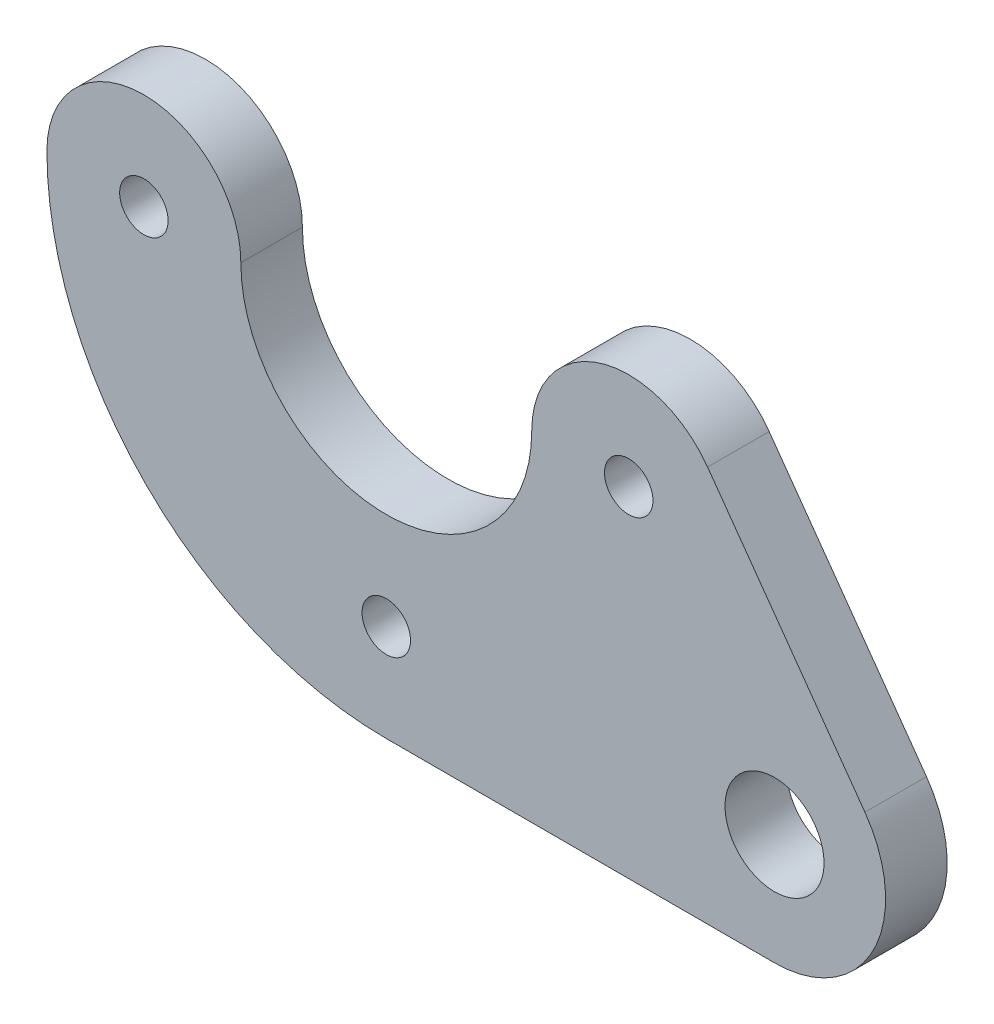
ISO-10303-21;
HEADER;
FILE_DESCRIPTION(('STEP AP214'),'2;1');
FILE_NAME('part.step','',(''),(''),'','','');
FILE_SCHEMA(('AUTOMOTIVE_DESIGN { 1 0 10303 214 1 1 1 1 }'));
ENDSEC;
DATA;
#1=APPLICATION_CONTEXT('core data for automotive mechanical design processes');
#2=APPLICATION_PROTOCOL_DEFINITION('international standard','automotive_design',2000,#1);
#3=PRODUCT_CONTEXT('',#1,'mechanical');
#4=PRODUCT('Part','Part','',(#3));
#5=PRODUCT_RELATED_PRODUCT_CATEGORY('part','',(#4));
#6=PRODUCT_DEFINITION_FORMATION('','',#4);
#7=PRODUCT_DEFINITION_CONTEXT('part definition',#1,'design');
#8=PRODUCT_DEFINITION('design','',#6,#7);
#9=PRODUCT_DEFINITION_SHAPE('','',#8);
#10=(LENGTH_UNIT() NAMED_UNIT(*) SI_UNIT(.MILLI.,.METRE.));
#11=(NAMED_UNIT(*) PLANE_ANGLE_UNIT() SI_UNIT($,.RADIAN.));
#12=(NAMED_UNIT(*) SI_UNIT($,.STERADIAN.) SOLID_ANGLE_UNIT());
#13=UNCERTAINTY_MEASURE_WITH_UNIT(LENGTH_MEASURE(1.E-05),#10,'distance_accuracy_value','');
#14=(GEOMETRIC_REPRESENTATION_CONTEXT(3) GLOBAL_UNCERTAINTY_ASSIGNED_CONTEXT((#13)) GLOBAL_UNIT_ASSIGNED_CONTEXT((#10,
#11,#12)) REPRESENTATION_CONTEXT('',''));
#15=CARTESIAN_POINT('',(0.,0.,0.));
#16=DIRECTION('',(0.,0.,1.));
#17=DIRECTION('',(1.,0.,0.));
#18=AXIS2_PLACEMENT_3D('',#15,#16,#17);
#19=CARTESIAN_POINT('',(-12.5,0.,3.175));
#20=DIRECTION('',(0.,0.,1.));
#21=DIRECTION('',(1.,0.,0.));
#22=AXIS2_PLACEMENT_3D('',#19,#20,#21);
#23=PLANE('',#22);
#24=CARTESIAN_POINT('',(-12.5,0.,3.175));
#25=DIRECTION('',(0.,0.,1.));
#26=DIRECTION('',(1.,0.,0.));
#27=AXIS2_PLACEMENT_3D('',#24,#25,#26);
#28=CIRCLE('',#27,1.25000000000003);
#29=CARTESIAN_POINT('',(-11.25,0.,3.175));
#30=VERTEX_POINT('',#29);
#31=EDGE_CURVE('E176',#30,#30,#28,.T.);
#32=ORIENTED_EDGE('',*,*,#31,.F.);
#33=EDGE_LOOP('',(#32));
#34=FACE_BOUND('',#33,.T.);
#35=CARTESIAN_POINT('',(12.5,0.,3.175));
#36=DIRECTION('',(0.,0.,1.));
#37=DIRECTION('',(1.,0.,0.));
#38=AXIS2_PLACEMENT_3D('',#35,#36,#37);
#39=CIRCLE('',#38,1.25);
#40=CARTESIAN_POINT('',(13.75,0.,3.175));
#41=VERTEX_POINT('',#40);
#42=EDGE_CURVE('E134',#41,#41,#39,.T.);
#43=ORIENTED_EDGE('',*,*,#42,.F.);
#44=EDGE_LOOP('',(#43));
#45=FACE_BOUND('',#44,.T.);
#46=CARTESIAN_POINT('',(-12.5,0.,3.175));
#47=DIRECTION('',(0.,0.,1.));
#48=DIRECTION('',(1.,0.,0.));
#49=AXIS2_PLACEMENT_3D('',#46,#47,#48);
#50=CIRCLE('',#49,5.00000000000043);
#51=CARTESIAN_POINT('',(-7.50000000000053,0.,3.175));
#52=VERTEX_POINT('',#51);
#53=CARTESIAN_POINT('',(-17.4999999999998,-6.97297373615333E-13,3.175));
#54=VERTEX_POINT('',#53);
#55=EDGE_CURVE('E143',#52,#54,#50,.T.);
#56=ORIENTED_EDGE('',*,*,#55,.T.);
#57=CARTESIAN_POINT('',(0.,0.,3.175));
#58=DIRECTION('',(0.,0.,1.));
#59=DIRECTION('',(1.,0.,0.));
#60=AXIS2_PLACEMENT_3D('',#57,#58,#59);
#61=CIRCLE('',#60,17.4999999999998);
#62=CARTESIAN_POINT('',(-0.0061847159722275,-17.4999989071223,3.175));
#63=VERTEX_POINT('',#62);
#64=EDGE_CURVE('E96',#54,#63,#61,.T.);
#65=ORIENTED_EDGE('',*,*,#64,.T.);
#66=DIRECTION('',(0.999999937549857,-0.000353412341224095,0.));
#67=VECTOR('',#66,1.);
#68=CARTESIAN_POINT('',(-0.00618471597222661,-17.4999989071207,3.175));
#69=LINE('',#68,#67);
#70=CARTESIAN_POINT('',(20.0172752728198,-17.5070754454367,3.175));
#71=VERTEX_POINT('',#70);
#72=EDGE_CURVE('E155',#63,#71,#69,.T.);
#73=ORIENTED_EDGE('',*,*,#72,.T.);
#74=CARTESIAN_POINT('',(20.0192995126867,-11.7793758031285,3.175));
#75=DIRECTION('',(0.,0.,1.));
#76=DIRECTION('',(1.,0.,0.));
#77=AXIS2_PLACEMENT_3D('',#74,#75,#76);
#78=CIRCLE('',#77,5.72770000000382);
#79=CARTESIAN_POINT('',(24.6801725811364,-8.45029041373949,3.175));
#80=VERTEX_POINT('',#79);
#81=EDGE_CURVE('E112',#71,#80,#78,.T.);
#82=ORIENTED_EDGE('',*,*,#81,.T.);
#83=DIRECTION('',(-0.581225516243314,0.813742526397443,0.));
#84=VECTOR('',#83,1.);
#85=CARTESIAN_POINT('',(16.5687126319865,2.90612758121607,3.175));
#86=LINE('',#85,#84);
#87=CARTESIAN_POINT('',(16.5687126319865,2.90612758121607,3.175));
#88=VERTEX_POINT('',#87);
#89=EDGE_CURVE('E106',#80,#88,#86,.T.);
#90=ORIENTED_EDGE('',*,*,#89,.T.);
#91=CARTESIAN_POINT('',(12.5,0.,3.175));
#92=DIRECTION('',(0.,0.,1.));
#93=DIRECTION('',(1.,0.,0.));
#94=AXIS2_PLACEMENT_3D('',#91,#92,#93);
#95=CIRCLE('',#94,4.99999999999931);
#96=CARTESIAN_POINT('',(7.5000000000007,0.,3.175));
#97=VERTEX_POINT('',#96);
#98=EDGE_CURVE('E110',#88,#97,#95,.T.);
#99=ORIENTED_EDGE('',*,*,#98,.T.);
#100=CARTESIAN_POINT('',(0.,0.,3.175));
#101=DIRECTION('',(0.,0.,-1.));
#102=DIRECTION('',(1.,0.,0.));
#103=AXIS2_PLACEMENT_3D('',#100,#101,#102);
#104=CIRCLE('',#103,7.50000000000053);
#105=EDGE_CURVE('E56',#97,#52,#104,.T.);
#106=ORIENTED_EDGE('',*,*,#105,.T.);
#107=EDGE_LOOP('',(#56,#65,#73,#82,#90,#99,#106));
#108=FACE_BOUND('',#107,.T.);
#109=CARTESIAN_POINT('',(0.,-12.5,3.175));
#110=DIRECTION('',(0.,0.,1.));
#111=DIRECTION('',(1.,0.,0.));
#112=AXIS2_PLACEMENT_3D('',#109,#110,#111);
#113=CIRCLE('',#112,1.25);
#114=CARTESIAN_POINT('',(1.25,-12.5,3.175));
#115=VERTEX_POINT('',#114);
#116=EDGE_CURVE('E170',#115,#115,#113,.T.);
#117=ORIENTED_EDGE('',*,*,#116,.F.);
#118=EDGE_LOOP('',(#117));
#119=FACE_BOUND('',#118,.T.);
#120=CARTESIAN_POINT('',(20.0192995126867,-11.7793758031285,3.175));
#121=DIRECTION('',(0.,0.,1.));
#122=DIRECTION('',(1.,0.,0.));
#123=AXIS2_PLACEMENT_3D('',#120,#121,#122);
#124=CIRCLE('',#123,2.55270000000382);
#125=CARTESIAN_POINT('',(22.5719995126905,-11.7793758031285,3.175));
#126=VERTEX_POINT('',#125);
#127=EDGE_CURVE('E182',#126,#126,#124,.T.);
#128=ORIENTED_EDGE('',*,*,#127,.F.);
#129=EDGE_LOOP('',(#128));
#130=FACE_BOUND('',#129,.T.);
#131=ADVANCED_FACE('F39',(#34,#45,#108,#119,#130),#23,.T.);
#132=CARTESIAN_POINT('',(-12.5,0.,0.));
#133=DIRECTION('',(0.,0.,1.));
#134=DIRECTION('',(1.,0.,0.));
#135=AXIS2_PLACEMENT_3D('',#132,#133,#134);
#136=PLANE('',#135);
#137=CARTESIAN_POINT('',(-12.5,0.,0.));
#138=DIRECTION('',(0.,0.,1.));
#139=DIRECTION('',(1.,0.,0.));
#140=AXIS2_PLACEMENT_3D('',#137,#138,#139);
#141=CIRCLE('',#140,5.00000000000043);
#142=CARTESIAN_POINT('',(-7.50000000000053,0.,0.));
#143=VERTEX_POINT('',#142);
#144=CARTESIAN_POINT('',(-17.4999999999998,-6.97297373615333E-13,0.));
#145=VERTEX_POINT('',#144);
#146=EDGE_CURVE('E130',#143,#145,#141,.T.);
#147=ORIENTED_EDGE('',*,*,#146,.F.);
#148=CARTESIAN_POINT('',(0.,0.,0.));
#149=DIRECTION('',(0.,0.,-1.));
#150=DIRECTION('',(1.,0.,0.));
#151=AXIS2_PLACEMENT_3D('',#148,#149,#150);
#152=CIRCLE('',#151,7.50000000000053);
#153=CARTESIAN_POINT('',(7.5000000000007,0.,0.));
#154=VERTEX_POINT('',#153);
#155=EDGE_CURVE('E88',#154,#143,#152,.T.);
#156=ORIENTED_EDGE('',*,*,#155,.F.);
#157=CARTESIAN_POINT('',(12.5,0.,0.));
#158=DIRECTION('',(0.,0.,1.));
#159=DIRECTION('',(1.,0.,0.));
#160=AXIS2_PLACEMENT_3D('',#157,#158,#159);
#161=CIRCLE('',#160,4.99999999999931);
#162=CARTESIAN_POINT('',(16.5687126319865,2.90612758121607,0.));
#163=VERTEX_POINT('',#162);
#164=EDGE_CURVE('E82',#163,#154,#161,.T.);
#165=ORIENTED_EDGE('',*,*,#164,.F.);
#166=DIRECTION('',(-0.581225516243314,0.813742526397443,0.));
#167=VECTOR('',#166,1.);
#168=CARTESIAN_POINT('',(16.5687126319865,2.90612758121607,0.));
#169=LINE('',#168,#167);
#170=CARTESIAN_POINT('',(24.6801725811364,-8.45029041373949,0.));
#171=VERTEX_POINT('',#170);
#172=EDGE_CURVE('E120',#171,#163,#169,.T.);
#173=ORIENTED_EDGE('',*,*,#172,.F.);
#174=CARTESIAN_POINT('',(20.0192995126867,-11.7793758031285,0.));
#175=DIRECTION('',(0.,0.,1.));
#176=DIRECTION('',(1.,0.,0.));
#177=AXIS2_PLACEMENT_3D('',#174,#175,#176);
#178=CIRCLE('',#177,5.72770000000382);
#179=CARTESIAN_POINT('',(20.0172752728198,-17.5070754454367,0.));
#180=VERTEX_POINT('',#179);
#181=EDGE_CURVE('E138',#180,#171,#178,.T.);
#182=ORIENTED_EDGE('',*,*,#181,.F.);
#183=DIRECTION('',(0.999999937549857,-0.000353412341224095,0.));
#184=VECTOR('',#183,1.);
#185=CARTESIAN_POINT('',(-0.00618471597222661,-17.4999989071207,0.));
#186=LINE('',#185,#184);
#187=CARTESIAN_POINT('',(-0.0061847159722275,-17.4999989071223,0.));
#188=VERTEX_POINT('',#187);
#189=EDGE_CURVE('E136',#188,#180,#186,.T.);
#190=ORIENTED_EDGE('',*,*,#189,.F.);
#191=CARTESIAN_POINT('',(0.,0.,0.));
#192=DIRECTION('',(0.,0.,1.));
#193=DIRECTION('',(1.,0.,0.));
#194=AXIS2_PLACEMENT_3D('',#191,#192,#193);
#195=CIRCLE('',#194,17.4999999999998);
#196=EDGE_CURVE('E133',#145,#188,#195,.T.);
#197=ORIENTED_EDGE('',*,*,#196,.F.);
#198=EDGE_LOOP('',(#147,#156,#165,#173,#182,#190,#197));
#199=FACE_BOUND('',#198,.T.);
#200=CARTESIAN_POINT('',(12.5,0.,0.));
#201=DIRECTION('',(0.,0.,1.));
#202=DIRECTION('',(1.,0.,0.));
#203=AXIS2_PLACEMENT_3D('',#200,#201,#202);
#204=CIRCLE('',#203,1.25);
#205=CARTESIAN_POINT('',(13.75,0.,0.));
#206=VERTEX_POINT('',#205);
#207=EDGE_CURVE('E167',#206,#206,#204,.T.);
#208=ORIENTED_EDGE('',*,*,#207,.T.);
#209=EDGE_LOOP('',(#208));
#210=FACE_BOUND('',#209,.T.);
#211=CARTESIAN_POINT('',(0.,-12.5,0.));
#212=DIRECTION('',(0.,0.,1.));
#213=DIRECTION('',(1.,0.,0.));
#214=AXIS2_PLACEMENT_3D('',#211,#212,#213);
#215=CIRCLE('',#214,1.25);
#216=CARTESIAN_POINT('',(1.25,-12.5,0.));
#217=VERTEX_POINT('',#216);
#218=EDGE_CURVE('E173',#217,#217,#215,.T.);
#219=ORIENTED_EDGE('',*,*,#218,.T.);
#220=EDGE_LOOP('',(#219));
#221=FACE_BOUND('',#220,.T.);
#222=CARTESIAN_POINT('',(-12.5,0.,0.));
#223=DIRECTION('',(0.,0.,1.));
#224=DIRECTION('',(1.,0.,0.));
#225=AXIS2_PLACEMENT_3D('',#222,#223,#224);
#226=CIRCLE('',#225,1.25000000000003);
#227=CARTESIAN_POINT('',(-11.25,0.,0.));
#228=VERTEX_POINT('',#227);
#229=EDGE_CURVE('E179',#228,#228,#226,.T.);
#230=ORIENTED_EDGE('',*,*,#229,.T.);
#231=EDGE_LOOP('',(#230));
#232=FACE_BOUND('',#231,.T.);
#233=CARTESIAN_POINT('',(20.0192995126867,-11.7793758031285,0.));
#234=DIRECTION('',(0.,0.,1.));
#235=DIRECTION('',(1.,0.,0.));
#236=AXIS2_PLACEMENT_3D('',#233,#234,#235);
#237=CIRCLE('',#236,2.55270000000382);
#238=CARTESIAN_POINT('',(22.5719995126905,-11.7793758031285,0.));
#239=VERTEX_POINT('',#238);
#240=EDGE_CURVE('E185',#239,#239,#237,.T.);
#241=ORIENTED_EDGE('',*,*,#240,.T.);
#242=EDGE_LOOP('',(#241));
#243=FACE_BOUND('',#242,.T.);
#244=ADVANCED_FACE('F159',(#199,#210,#221,#232,#243),#136,.F.);
#245=CARTESIAN_POINT('',(-12.5,0.,3.175));
#246=DIRECTION('',(0.,0.,-1.));
#247=DIRECTION('',(-1.,0.,0.));
#248=AXIS2_PLACEMENT_3D('',#245,#246,#247);
#249=CYLINDRICAL_SURFACE('',#248,5.00000000000043);
#250=ORIENTED_EDGE('',*,*,#146,.T.);
#251=DIRECTION('',(0.,0.,-1.));
#252=VECTOR('',#251,1.);
#253=CARTESIAN_POINT('',(-17.4999999999998,-6.97297373615333E-13,3.175));
#254=LINE('',#253,#252);
#255=EDGE_CURVE('E11',#54,#145,#254,.T.);
#256=ORIENTED_EDGE('',*,*,#255,.F.);
#257=ORIENTED_EDGE('',*,*,#55,.F.);
#258=DIRECTION('',(0.,0.,-1.));
#259=VECTOR('',#258,1.);
#260=CARTESIAN_POINT('',(-7.50000000000053,0.,3.175));
#261=LINE('',#260,#259);
#262=EDGE_CURVE('E126',#52,#143,#261,.T.);
#263=ORIENTED_EDGE('',*,*,#262,.T.);
#264=EDGE_LOOP('',(#250,#256,#257,#263));
#265=FACE_BOUND('',#264,.T.);
#266=ADVANCED_FACE('F41',(#265),#249,.T.);
#267=CARTESIAN_POINT('',(0.,0.,3.175));
#268=DIRECTION('',(0.,0.,-1.));
#269=DIRECTION('',(-1.,0.,0.));
#270=AXIS2_PLACEMENT_3D('',#267,#268,#269);
#271=CYLINDRICAL_SURFACE('',#270,17.4999999999998);
#272=ORIENTED_EDGE('',*,*,#196,.T.);
#273=DIRECTION('',(0.,0.,-1.));
#274=VECTOR('',#273,1.);
#275=CARTESIAN_POINT('',(-0.0061847159722275,-17.4999989071223,3.175));
#276=LINE('',#275,#274);
#277=EDGE_CURVE('E48',#63,#188,#276,.T.);
#278=ORIENTED_EDGE('',*,*,#277,.F.);
#279=ORIENTED_EDGE('',*,*,#64,.F.);
#280=ORIENTED_EDGE('',*,*,#255,.T.);
#281=EDGE_LOOP('',(#272,#278,#279,#280));
#282=FACE_BOUND('',#281,.T.);
#283=ADVANCED_FACE('F217',(#282),#271,.T.);
#284=CARTESIAN_POINT('',(-0.00618471597222661,-17.4999989071207,3.175));
#285=DIRECTION('',(0.000353412341224095,0.999999937549857,0.));
#286=DIRECTION('',(-0.999999937549857,0.000353412341224095,0.));
#287=AXIS2_PLACEMENT_3D('',#284,#285,#286);
#288=PLANE('',#287);
#289=ORIENTED_EDGE('',*,*,#189,.T.);
#290=DIRECTION('',(0.,0.,-1.));
#291=VECTOR('',#290,1.);
#292=CARTESIAN_POINT('',(20.0172752728198,-17.5070754454367,3.175));
#293=LINE('',#292,#291);
#294=EDGE_CURVE('E147',#71,#180,#293,.T.);
#295=ORIENTED_EDGE('',*,*,#294,.F.);
#296=ORIENTED_EDGE('',*,*,#72,.F.);
#297=ORIENTED_EDGE('',*,*,#277,.T.);
#298=EDGE_LOOP('',(#289,#295,#296,#297));
#299=FACE_BOUND('',#298,.T.);
#300=ADVANCED_FACE('F153',(#299),#288,.F.);
#301=CARTESIAN_POINT('',(20.0192995126867,-11.7793758031285,3.175));
#302=DIRECTION('',(0.,0.,-1.));
#303=DIRECTION('',(-1.,0.,0.));
#304=AXIS2_PLACEMENT_3D('',#301,#302,#303);
#305=CYLINDRICAL_SURFACE('',#304,5.72770000000382);
#306=ORIENTED_EDGE('',*,*,#181,.T.);
#307=DIRECTION('',(0.,0.,-1.));
#308=VECTOR('',#307,1.);
#309=CARTESIAN_POINT('',(24.6801725811364,-8.45029041373949,3.175));
#310=LINE('',#309,#308);
#311=EDGE_CURVE('E121',#80,#171,#310,.T.);
#312=ORIENTED_EDGE('',*,*,#311,.F.);
#313=ORIENTED_EDGE('',*,*,#81,.F.);
#314=ORIENTED_EDGE('',*,*,#294,.T.);
#315=EDGE_LOOP('',(#306,#312,#313,#314));
#316=FACE_BOUND('',#315,.T.);
#317=ADVANCED_FACE('F162',(#316),#305,.T.);
#318=CARTESIAN_POINT('',(16.5687126319865,2.90612758121607,3.175));
#319=DIRECTION('',(-0.813742526397443,-0.581225516243314,0.));
#320=DIRECTION('',(0.581225516243314,-0.813742526397443,0.));
#321=AXIS2_PLACEMENT_3D('',#318,#319,#320);
#322=PLANE('',#321);
#323=ORIENTED_EDGE('',*,*,#172,.T.);
#324=DIRECTION('',(0.,0.,-1.));
#325=VECTOR('',#324,1.);
#326=CARTESIAN_POINT('',(16.5687126319865,2.90612758121607,3.175));
#327=LINE('',#326,#325);
#328=EDGE_CURVE('E117',#88,#163,#327,.T.);
#329=ORIENTED_EDGE('',*,*,#328,.F.);
#330=ORIENTED_EDGE('',*,*,#89,.F.);
#331=ORIENTED_EDGE('',*,*,#311,.T.);
#332=EDGE_LOOP('',(#323,#329,#330,#331));
#333=FACE_BOUND('',#332,.T.);
#334=ADVANCED_FACE('F118',(#333),#322,.F.);
#335=CARTESIAN_POINT('',(12.5,0.,3.175));
#336=DIRECTION('',(0.,0.,-1.));
#337=DIRECTION('',(-1.,0.,0.));
#338=AXIS2_PLACEMENT_3D('',#335,#336,#337);
#339=CYLINDRICAL_SURFACE('',#338,4.99999999999931);
#340=ORIENTED_EDGE('',*,*,#164,.T.);
#341=DIRECTION('',(0.,0.,-1.));
#342=VECTOR('',#341,1.);
#343=CARTESIAN_POINT('',(7.5000000000007,0.,3.175));
#344=LINE('',#343,#342);
#345=EDGE_CURVE('E122',#97,#154,#344,.T.);
#346=ORIENTED_EDGE('',*,*,#345,.F.);
#347=ORIENTED_EDGE('',*,*,#98,.F.);
#348=ORIENTED_EDGE('',*,*,#328,.T.);
#349=EDGE_LOOP('',(#340,#346,#347,#348));
#350=FACE_BOUND('',#349,.T.);
#351=ADVANCED_FACE('F124',(#350),#339,.T.);
#352=CARTESIAN_POINT('',(0.,0.,3.175));
#353=DIRECTION('',(0.,0.,-1.));
#354=DIRECTION('',(-1.,0.,0.));
#355=AXIS2_PLACEMENT_3D('',#352,#353,#354);
#356=CYLINDRICAL_SURFACE('',#355,7.50000000000053);
#357=ORIENTED_EDGE('',*,*,#155,.T.);
#358=ORIENTED_EDGE('',*,*,#262,.F.);
#359=ORIENTED_EDGE('',*,*,#105,.F.);
#360=ORIENTED_EDGE('',*,*,#345,.T.);
#361=EDGE_LOOP('',(#357,#358,#359,#360));
#362=FACE_BOUND('',#361,.T.);
#363=ADVANCED_FACE('F207',(#362),#356,.F.);
#364=CARTESIAN_POINT('',(12.5,0.,3.175));
#365=DIRECTION('',(0.,0.,-1.));
#366=DIRECTION('',(-1.,0.,0.));
#367=AXIS2_PLACEMENT_3D('',#364,#365,#366);
#368=CYLINDRICAL_SURFACE('',#367,1.25);
#369=ORIENTED_EDGE('',*,*,#42,.T.);
#370=EDGE_LOOP('',(#369));
#371=FACE_BOUND('',#370,.T.);
#372=ORIENTED_EDGE('',*,*,#207,.F.);
#373=EDGE_LOOP('',(#372));
#374=FACE_BOUND('',#373,.T.);
#375=ADVANCED_FACE('F204',(#371,#374),#368,.F.);
#376=CARTESIAN_POINT('',(0.,-12.5,3.175));
#377=DIRECTION('',(0.,0.,-1.));
#378=DIRECTION('',(-1.,0.,0.));
#379=AXIS2_PLACEMENT_3D('',#376,#377,#378);
#380=CYLINDRICAL_SURFACE('',#379,1.25);
#381=ORIENTED_EDGE('',*,*,#116,.T.);
#382=EDGE_LOOP('',(#381));
#383=FACE_BOUND('',#382,.T.);
#384=ORIENTED_EDGE('',*,*,#218,.F.);
#385=EDGE_LOOP('',(#384));
#386=FACE_BOUND('',#385,.T.);
#387=ADVANCED_FACE('F275',(#383,#386),#380,.F.);
#388=CARTESIAN_POINT('',(-12.5,0.,3.175));
#389=DIRECTION('',(0.,0.,-1.));
#390=DIRECTION('',(-1.,0.,0.));
#391=AXIS2_PLACEMENT_3D('',#388,#389,#390);
#392=CYLINDRICAL_SURFACE('',#391,1.25000000000003);
#393=ORIENTED_EDGE('',*,*,#31,.T.);
#394=EDGE_LOOP('',(#393));
#395=FACE_BOUND('',#394,.T.);
#396=ORIENTED_EDGE('',*,*,#229,.F.);
#397=EDGE_LOOP('',(#396));
#398=FACE_BOUND('',#397,.T.);
#399=ADVANCED_FACE('F283',(#395,#398),#392,.F.);
#400=CARTESIAN_POINT('',(20.0192995126867,-11.7793758031285,3.175));
#401=DIRECTION('',(0.,0.,-1.));
#402=DIRECTION('',(-1.,0.,0.));
#403=AXIS2_PLACEMENT_3D('',#400,#401,#402);
#404=CYLINDRICAL_SURFACE('',#403,2.55270000000382);
#405=ORIENTED_EDGE('',*,*,#127,.T.);
#406=EDGE_LOOP('',(#405));
#407=FACE_BOUND('',#406,.T.);
#408=ORIENTED_EDGE('',*,*,#240,.F.);
#409=EDGE_LOOP('',(#408));
#410=FACE_BOUND('',#409,.T.);
#411=ADVANCED_FACE('F191',(#407,#410),#404,.F.);
#412=CLOSED_SHELL('',(#131,#244,#266,#283,#300,#317,#334,#351,#363,#375,#387,#399,#411));
#413=MANIFOLD_SOLID_BREP('B2',#412);
#414=ADVANCED_BREP_SHAPE_REPRESENTATION('',(#18,#413),#14);
#415=SHAPE_DEFINITION_REPRESENTATION(#9,#414);
ENDSEC;
END-ISO-10303-21;
